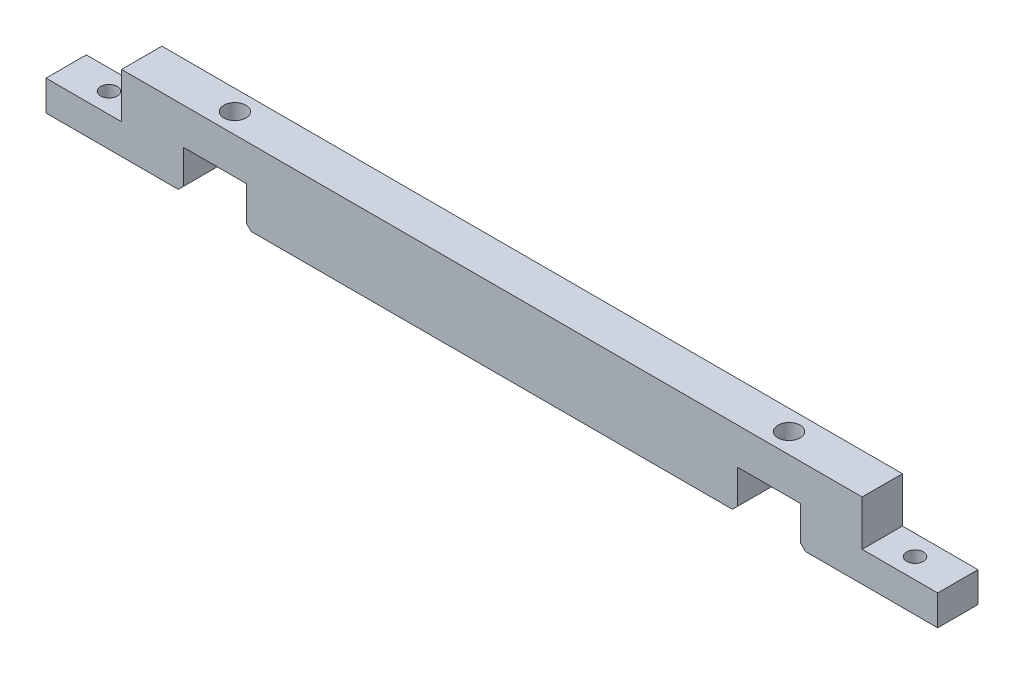
ISO-10303-21;
HEADER;
FILE_DESCRIPTION(('STEP AP214'),'2;1');
FILE_NAME('part.step','',(''),(''),'','','');
FILE_SCHEMA(('AUTOMOTIVE_DESIGN { 1 0 10303 214 1 1 1 1 }'));
ENDSEC;
DATA;
#1=APPLICATION_CONTEXT('core data for automotive mechanical design processes');
#2=APPLICATION_PROTOCOL_DEFINITION('international standard','automotive_design',2000,#1);
#3=PRODUCT_CONTEXT('',#1,'mechanical');
#4=PRODUCT('Part','Part','',(#3));
#5=PRODUCT_RELATED_PRODUCT_CATEGORY('part','',(#4));
#6=PRODUCT_DEFINITION_FORMATION('','',#4);
#7=PRODUCT_DEFINITION_CONTEXT('part definition',#1,'design');
#8=PRODUCT_DEFINITION('design','',#6,#7);
#9=PRODUCT_DEFINITION_SHAPE('','',#8);
#10=(LENGTH_UNIT() NAMED_UNIT(*) SI_UNIT(.MILLI.,.METRE.));
#11=(NAMED_UNIT(*) PLANE_ANGLE_UNIT() SI_UNIT($,.RADIAN.));
#12=(NAMED_UNIT(*) SI_UNIT($,.STERADIAN.) SOLID_ANGLE_UNIT());
#13=UNCERTAINTY_MEASURE_WITH_UNIT(LENGTH_MEASURE(1.E-05),#10,'distance_accuracy_value','');
#14=(GEOMETRIC_REPRESENTATION_CONTEXT(3) GLOBAL_UNCERTAINTY_ASSIGNED_CONTEXT((#13)) GLOBAL_UNIT_ASSIGNED_CONTEXT((#10,
#11,#12)) REPRESENTATION_CONTEXT('',''));
#15=CARTESIAN_POINT('',(0.,0.,0.));
#16=DIRECTION('',(0.,0.,1.));
#17=DIRECTION('',(1.,0.,0.));
#18=AXIS2_PLACEMENT_3D('',#15,#16,#17);
#19=CARTESIAN_POINT('',(-177.,15.,-8.));
#20=DIRECTION('',(0.,0.,1.));
#21=DIRECTION('',(1.,0.,0.));
#22=AXIS2_PLACEMENT_3D('',#19,#20,#21);
#23=PLANE('',#22);
#24=DIRECTION('',(-1.,0.,0.));
#25=VECTOR('',#24,1.);
#26=CARTESIAN_POINT('',(177.,-3.,-8.));
#27=LINE('',#26,#25);
#28=CARTESIAN_POINT('',(177.,-3.,-8.));
#29=VERTEX_POINT('',#28);
#30=CARTESIAN_POINT('',(147.,-3.,-8.));
#31=VERTEX_POINT('',#30);
#32=EDGE_CURVE('E192',#29,#31,#27,.T.);
#33=ORIENTED_EDGE('',*,*,#32,.F.);
#34=DIRECTION('',(0.,-1.,0.));
#35=VECTOR('',#34,1.);
#36=CARTESIAN_POINT('',(177.,15.,-8.));
#37=LINE('',#36,#35);
#38=CARTESIAN_POINT('',(177.,-15.,-8.));
#39=VERTEX_POINT('',#38);
#40=EDGE_CURVE('E359',#29,#39,#37,.T.);
#41=ORIENTED_EDGE('',*,*,#40,.T.);
#42=DIRECTION('',(-1.,0.,0.));
#43=VECTOR('',#42,1.);
#44=CARTESIAN_POINT('',(-177.,-15.,-8.));
#45=LINE('',#44,#43);
#46=CARTESIAN_POINT('',(124.5,-15.,-8.));
#47=VERTEX_POINT('',#46);
#48=EDGE_CURVE('E337',#39,#47,#45,.T.);
#49=ORIENTED_EDGE('',*,*,#48,.T.);
#50=DIRECTION('',(0.707106781186538,-0.707106781186557,0.));
#51=VECTOR('',#50,1.);
#52=CARTESIAN_POINT('',(124.5,-15.,-8.));
#53=LINE('',#52,#51);
#54=CARTESIAN_POINT('',(122.5,-13.,-8.));
#55=VERTEX_POINT('',#54);
#56=EDGE_CURVE('E372',#47,#55,#53,.F.);
#57=ORIENTED_EDGE('',*,*,#56,.T.);
#58=DIRECTION('',(0.,1.,0.));
#59=VECTOR('',#58,1.);
#60=CARTESIAN_POINT('',(122.5,0.5,-8.));
#61=LINE('',#60,#59);
#62=CARTESIAN_POINT('',(122.5,0.5,-8.));
#63=VERTEX_POINT('',#62);
#64=EDGE_CURVE('E298',#55,#63,#61,.T.);
#65=ORIENTED_EDGE('',*,*,#64,.T.);
#66=DIRECTION('',(-1.,0.,0.));
#67=VECTOR('',#66,1.);
#68=CARTESIAN_POINT('',(97.5,0.5,-8.));
#69=LINE('',#68,#67);
#70=CARTESIAN_POINT('',(97.5,0.5,-8.));
#71=VERTEX_POINT('',#70);
#72=EDGE_CURVE('E302',#63,#71,#69,.T.);
#73=ORIENTED_EDGE('',*,*,#72,.T.);
#74=DIRECTION('',(0.,-1.,0.));
#75=VECTOR('',#74,1.);
#76=CARTESIAN_POINT('',(97.5,0.5,-8.));
#77=LINE('',#76,#75);
#78=CARTESIAN_POINT('',(97.5,-12.9999999999999,-8.));
#79=VERTEX_POINT('',#78);
#80=EDGE_CURVE('E294',#71,#79,#77,.T.);
#81=ORIENTED_EDGE('',*,*,#80,.T.);
#82=DIRECTION('',(0.707106781186538,0.707106781186557,0.));
#83=VECTOR('',#82,1.);
#84=CARTESIAN_POINT('',(95.5,-15.,-8.));
#85=LINE('',#84,#83);
#86=CARTESIAN_POINT('',(95.5,-15.,-8.));
#87=VERTEX_POINT('',#86);
#88=EDGE_CURVE('E369',#79,#87,#85,.F.);
#89=ORIENTED_EDGE('',*,*,#88,.T.);
#90=CARTESIAN_POINT('',(-95.5,-15.,-8.));
#91=VERTEX_POINT('',#90);
#92=EDGE_CURVE('E342',#87,#91,#45,.T.);
#93=ORIENTED_EDGE('',*,*,#92,.T.);
#94=DIRECTION('',(-0.707106781186538,0.707106781186557,0.));
#95=VECTOR('',#94,1.);
#96=CARTESIAN_POINT('',(-97.5,-12.9999999999999,-8.));
#97=LINE('',#96,#95);
#98=CARTESIAN_POINT('',(-97.5,-12.9999999999999,-8.));
#99=VERTEX_POINT('',#98);
#100=EDGE_CURVE('E402',#91,#99,#97,.T.);
#101=ORIENTED_EDGE('',*,*,#100,.T.);
#102=DIRECTION('',(0.,-1.,0.));
#103=VECTOR('',#102,1.);
#104=CARTESIAN_POINT('',(-97.5,0.5,-8.));
#105=LINE('',#104,#103);
#106=CARTESIAN_POINT('',(-97.5,0.5,-8.));
#107=VERTEX_POINT('',#106);
#108=EDGE_CURVE('E268',#107,#99,#105,.T.);
#109=ORIENTED_EDGE('',*,*,#108,.F.);
#110=DIRECTION('',(1.,0.,0.));
#111=VECTOR('',#110,1.);
#112=CARTESIAN_POINT('',(-97.5,0.5,-8.));
#113=LINE('',#112,#111);
#114=CARTESIAN_POINT('',(-122.5,0.5,-8.));
#115=VERTEX_POINT('',#114);
#116=EDGE_CURVE('E272',#115,#107,#113,.T.);
#117=ORIENTED_EDGE('',*,*,#116,.F.);
#118=DIRECTION('',(0.,1.,0.));
#119=VECTOR('',#118,1.);
#120=CARTESIAN_POINT('',(-122.5,0.5,-8.));
#121=LINE('',#120,#119);
#122=CARTESIAN_POINT('',(-122.5,-13.,-8.));
#123=VERTEX_POINT('',#122);
#124=EDGE_CURVE('E276',#123,#115,#121,.T.);
#125=ORIENTED_EDGE('',*,*,#124,.F.);
#126=DIRECTION('',(-0.707106781186538,-0.707106781186557,0.));
#127=VECTOR('',#126,1.);
#128=CARTESIAN_POINT('',(-122.5,-13.,-8.));
#129=LINE('',#128,#127);
#130=CARTESIAN_POINT('',(-124.5,-15.,-8.));
#131=VERTEX_POINT('',#130);
#132=EDGE_CURVE('E405',#123,#131,#129,.T.);
#133=ORIENTED_EDGE('',*,*,#132,.T.);
#134=CARTESIAN_POINT('',(-177.,-15.,-8.));
#135=VERTEX_POINT('',#134);
#136=EDGE_CURVE('E336',#131,#135,#45,.T.);
#137=ORIENTED_EDGE('',*,*,#136,.T.);
#138=DIRECTION('',(0.,-1.,0.));
#139=VECTOR('',#138,1.);
#140=CARTESIAN_POINT('',(-177.,15.,-8.));
#141=LINE('',#140,#139);
#142=CARTESIAN_POINT('',(-177.,-3.,-8.));
#143=VERTEX_POINT('',#142);
#144=EDGE_CURVE('E356',#143,#135,#141,.T.);
#145=ORIENTED_EDGE('',*,*,#144,.F.);
#146=DIRECTION('',(1.,0.,0.));
#147=VECTOR('',#146,1.);
#148=CARTESIAN_POINT('',(-177.,-3.,-8.));
#149=LINE('',#148,#147);
#150=CARTESIAN_POINT('',(-147.,-3.,-8.));
#151=VERTEX_POINT('',#150);
#152=EDGE_CURVE('E229',#143,#151,#149,.T.);
#153=ORIENTED_EDGE('',*,*,#152,.T.);
#154=DIRECTION('',(0.,1.,0.));
#155=VECTOR('',#154,1.);
#156=CARTESIAN_POINT('',(-147.,15.,-8.));
#157=LINE('',#156,#155);
#158=CARTESIAN_POINT('',(-147.,15.,-8.));
#159=VERTEX_POINT('',#158);
#160=EDGE_CURVE('E233',#151,#159,#157,.T.);
#161=ORIENTED_EDGE('',*,*,#160,.T.);
#162=DIRECTION('',(-1.,0.,0.));
#163=VECTOR('',#162,1.);
#164=CARTESIAN_POINT('',(-177.,15.,-8.));
#165=LINE('',#164,#163);
#166=CARTESIAN_POINT('',(147.,15.,-8.));
#167=VERTEX_POINT('',#166);
#168=EDGE_CURVE('E211',#167,#159,#165,.T.);
#169=ORIENTED_EDGE('',*,*,#168,.F.);
#170=DIRECTION('',(0.,1.,0.));
#171=VECTOR('',#170,1.);
#172=CARTESIAN_POINT('',(147.,15.,-8.));
#173=LINE('',#172,#171);
#174=EDGE_CURVE('E70',#31,#167,#173,.T.);
#175=ORIENTED_EDGE('',*,*,#174,.F.);
#176=EDGE_LOOP('',(#33,#41,#49,#57,#65,#73,#81,#89,#93,#101,#109,#117,#125,#133,#137,#145,#153,
#161,#169,#175));
#177=FACE_BOUND('',#176,.T.);
#178=ADVANCED_FACE('F51',(#177),#23,.F.);
#179=CARTESIAN_POINT('',(-177.,15.,8.));
#180=DIRECTION('',(0.,0.,-1.));
#181=DIRECTION('',(-1.,0.,0.));
#182=AXIS2_PLACEMENT_3D('',#179,#180,#181);
#183=PLANE('',#182);
#184=DIRECTION('',(-1.,0.,0.));
#185=VECTOR('',#184,1.);
#186=CARTESIAN_POINT('',(177.,-3.,8.));
#187=LINE('',#186,#185);
#188=CARTESIAN_POINT('',(177.,-3.,8.));
#189=VERTEX_POINT('',#188);
#190=CARTESIAN_POINT('',(147.,-3.,8.));
#191=VERTEX_POINT('',#190);
#192=EDGE_CURVE('E213',#189,#191,#187,.T.);
#193=ORIENTED_EDGE('',*,*,#192,.T.);
#194=DIRECTION('',(0.,1.,0.));
#195=VECTOR('',#194,1.);
#196=CARTESIAN_POINT('',(147.,15.,8.));
#197=LINE('',#196,#195);
#198=CARTESIAN_POINT('',(147.,15.,8.));
#199=VERTEX_POINT('',#198);
#200=EDGE_CURVE('E205',#191,#199,#197,.T.);
#201=ORIENTED_EDGE('',*,*,#200,.T.);
#202=DIRECTION('',(1.,0.,0.));
#203=VECTOR('',#202,1.);
#204=CARTESIAN_POINT('',(-177.,15.,8.));
#205=LINE('',#204,#203);
#206=CARTESIAN_POINT('',(-147.,15.,8.));
#207=VERTEX_POINT('',#206);
#208=EDGE_CURVE('E326',#207,#199,#205,.T.);
#209=ORIENTED_EDGE('',*,*,#208,.F.);
#210=DIRECTION('',(0.,1.,0.));
#211=VECTOR('',#210,1.);
#212=CARTESIAN_POINT('',(-147.,15.,8.));
#213=LINE('',#212,#211);
#214=CARTESIAN_POINT('',(-147.,-3.,8.));
#215=VERTEX_POINT('',#214);
#216=EDGE_CURVE('E78',#215,#207,#213,.T.);
#217=ORIENTED_EDGE('',*,*,#216,.F.);
#218=DIRECTION('',(1.,0.,0.));
#219=VECTOR('',#218,1.);
#220=CARTESIAN_POINT('',(-177.,-3.,8.));
#221=LINE('',#220,#219);
#222=CARTESIAN_POINT('',(-177.,-3.,8.));
#223=VERTEX_POINT('',#222);
#224=EDGE_CURVE('E225',#223,#215,#221,.T.);
#225=ORIENTED_EDGE('',*,*,#224,.F.);
#226=DIRECTION('',(0.,-1.,0.));
#227=VECTOR('',#226,1.);
#228=CARTESIAN_POINT('',(-177.,15.,8.));
#229=LINE('',#228,#227);
#230=CARTESIAN_POINT('',(-177.,-15.,8.));
#231=VERTEX_POINT('',#230);
#232=EDGE_CURVE('E353',#223,#231,#229,.T.);
#233=ORIENTED_EDGE('',*,*,#232,.T.);
#234=DIRECTION('',(1.,0.,0.));
#235=VECTOR('',#234,1.);
#236=CARTESIAN_POINT('',(-177.,-15.,8.));
#237=LINE('',#236,#235);
#238=CARTESIAN_POINT('',(-124.5,-15.,8.));
#239=VERTEX_POINT('',#238);
#240=EDGE_CURVE('E327',#231,#239,#237,.T.);
#241=ORIENTED_EDGE('',*,*,#240,.T.);
#242=DIRECTION('',(0.707106781186538,0.707106781186557,0.));
#243=VECTOR('',#242,1.);
#244=CARTESIAN_POINT('',(-122.5,-13.,8.));
#245=LINE('',#244,#243);
#246=CARTESIAN_POINT('',(-122.5,-13.,8.));
#247=VERTEX_POINT('',#246);
#248=EDGE_CURVE('E414',#239,#247,#245,.T.);
#249=ORIENTED_EDGE('',*,*,#248,.T.);
#250=DIRECTION('',(0.,-1.,0.));
#251=VECTOR('',#250,1.);
#252=CARTESIAN_POINT('',(-122.5,15.,8.));
#253=LINE('',#252,#251);
#254=CARTESIAN_POINT('',(-122.5,0.5,8.));
#255=VERTEX_POINT('',#254);
#256=EDGE_CURVE('E391',#255,#247,#253,.T.);
#257=ORIENTED_EDGE('',*,*,#256,.F.);
#258=DIRECTION('',(1.,0.,0.));
#259=VECTOR('',#258,1.);
#260=CARTESIAN_POINT('',(-97.5,0.5,8.));
#261=LINE('',#260,#259);
#262=CARTESIAN_POINT('',(-97.5,0.5,8.));
#263=VERTEX_POINT('',#262);
#264=EDGE_CURVE('E273',#255,#263,#261,.T.);
#265=ORIENTED_EDGE('',*,*,#264,.T.);
#266=DIRECTION('',(0.,-1.,0.));
#267=VECTOR('',#266,1.);
#268=CARTESIAN_POINT('',(-97.5,0.5,8.));
#269=LINE('',#268,#267);
#270=CARTESIAN_POINT('',(-97.5,-12.9999999999999,8.));
#271=VERTEX_POINT('',#270);
#272=EDGE_CURVE('E280',#263,#271,#269,.T.);
#273=ORIENTED_EDGE('',*,*,#272,.T.);
#274=DIRECTION('',(0.707106781186538,-0.707106781186557,0.));
#275=VECTOR('',#274,1.);
#276=CARTESIAN_POINT('',(-97.5,-12.9999999999999,8.));
#277=LINE('',#276,#275);
#278=CARTESIAN_POINT('',(-95.5,-15.,8.));
#279=VERTEX_POINT('',#278);
#280=EDGE_CURVE('E411',#271,#279,#277,.T.);
#281=ORIENTED_EDGE('',*,*,#280,.T.);
#282=CARTESIAN_POINT('',(95.5,-15.,8.));
#283=VERTEX_POINT('',#282);
#284=EDGE_CURVE('E350',#279,#283,#237,.T.);
#285=ORIENTED_EDGE('',*,*,#284,.T.);
#286=DIRECTION('',(-0.707106781186538,-0.707106781186557,0.));
#287=VECTOR('',#286,1.);
#288=CARTESIAN_POINT('',(95.5,-15.,8.));
#289=LINE('',#288,#287);
#290=CARTESIAN_POINT('',(97.5,-12.9999999999999,8.));
#291=VERTEX_POINT('',#290);
#292=EDGE_CURVE('E378',#283,#291,#289,.F.);
#293=ORIENTED_EDGE('',*,*,#292,.T.);
#294=DIRECTION('',(0.,-1.,0.));
#295=VECTOR('',#294,1.);
#296=CARTESIAN_POINT('',(97.5,0.5,8.));
#297=LINE('',#296,#295);
#298=CARTESIAN_POINT('',(97.5,0.5,8.));
#299=VERTEX_POINT('',#298);
#300=EDGE_CURVE('E307',#299,#291,#297,.T.);
#301=ORIENTED_EDGE('',*,*,#300,.F.);
#302=DIRECTION('',(-1.,0.,0.));
#303=VECTOR('',#302,1.);
#304=CARTESIAN_POINT('',(97.5,0.5,8.));
#305=LINE('',#304,#303);
#306=CARTESIAN_POINT('',(122.5,0.5,8.));
#307=VERTEX_POINT('',#306);
#308=EDGE_CURVE('E299',#307,#299,#305,.T.);
#309=ORIENTED_EDGE('',*,*,#308,.F.);
#310=DIRECTION('',(0.,1.,0.));
#311=VECTOR('',#310,1.);
#312=CARTESIAN_POINT('',(122.5,0.5,8.));
#313=LINE('',#312,#311);
#314=CARTESIAN_POINT('',(122.5,-13.,8.));
#315=VERTEX_POINT('',#314);
#316=EDGE_CURVE('E311',#315,#307,#313,.T.);
#317=ORIENTED_EDGE('',*,*,#316,.F.);
#318=DIRECTION('',(-0.707106781186538,0.707106781186557,0.));
#319=VECTOR('',#318,1.);
#320=CARTESIAN_POINT('',(124.5,-15.,8.));
#321=LINE('',#320,#319);
#322=CARTESIAN_POINT('',(124.5,-15.,8.));
#323=VERTEX_POINT('',#322);
#324=EDGE_CURVE('E381',#315,#323,#321,.F.);
#325=ORIENTED_EDGE('',*,*,#324,.T.);
#326=CARTESIAN_POINT('',(177.,-15.,8.));
#327=VERTEX_POINT('',#326);
#328=EDGE_CURVE('E346',#323,#327,#237,.T.);
#329=ORIENTED_EDGE('',*,*,#328,.T.);
#330=DIRECTION('',(0.,-1.,0.));
#331=VECTOR('',#330,1.);
#332=CARTESIAN_POINT('',(177.,15.,8.));
#333=LINE('',#332,#331);
#334=EDGE_CURVE('E331',#189,#327,#333,.T.);
#335=ORIENTED_EDGE('',*,*,#334,.F.);
#336=EDGE_LOOP('',(#193,#201,#209,#217,#225,#233,#241,#249,#257,#265,#273,#281,#285,#293,#301,
#309,#317,#325,#329,#335));
#337=FACE_BOUND('',#336,.T.);
#338=ADVANCED_FACE('F518',(#337),#183,.F.);
#339=CARTESIAN_POINT('',(177.,15.,-8.));
#340=DIRECTION('',(-1.,0.,0.));
#341=DIRECTION('',(0.,0.,1.));
#342=AXIS2_PLACEMENT_3D('',#339,#340,#341);
#343=PLANE('',#342);
#344=DIRECTION('',(0.,0.,1.));
#345=VECTOR('',#344,1.);
#346=CARTESIAN_POINT('',(177.,-3.,-8.));
#347=LINE('',#346,#345);
#348=EDGE_CURVE('E197',#29,#189,#347,.T.);
#349=ORIENTED_EDGE('',*,*,#348,.T.);
#350=ORIENTED_EDGE('',*,*,#334,.T.);
#351=DIRECTION('',(0.,0.,-1.));
#352=VECTOR('',#351,1.);
#353=CARTESIAN_POINT('',(177.,-15.,-8.));
#354=LINE('',#353,#352);
#355=EDGE_CURVE('E332',#327,#39,#354,.T.);
#356=ORIENTED_EDGE('',*,*,#355,.T.);
#357=ORIENTED_EDGE('',*,*,#40,.F.);
#358=EDGE_LOOP('',(#349,#350,#356,#357));
#359=FACE_BOUND('',#358,.T.);
#360=ADVANCED_FACE('F541',(#359),#343,.F.);
#361=CARTESIAN_POINT('',(0.,15.,0.));
#362=DIRECTION('',(0.,1.,0.));
#363=DIRECTION('',(0.,0.,1.));
#364=AXIS2_PLACEMENT_3D('',#361,#362,#363);
#365=PLANE('',#364);
#366=CARTESIAN_POINT('',(-110.,15.,0.));
#367=DIRECTION('',(0.,1.,0.));
#368=DIRECTION('',(0.,0.,1.));
#369=AXIS2_PLACEMENT_3D('',#366,#367,#368);
#370=CIRCLE('',#369,4.39999999999999);
#371=CARTESIAN_POINT('',(-110.,15.,4.39999999999999));
#372=VERTEX_POINT('',#371);
#373=EDGE_CURVE('E245',#372,#372,#370,.T.);
#374=ORIENTED_EDGE('',*,*,#373,.F.);
#375=EDGE_LOOP('',(#374));
#376=FACE_BOUND('',#375,.T.);
#377=CARTESIAN_POINT('',(110.,15.,0.));
#378=DIRECTION('',(0.,1.,0.));
#379=DIRECTION('',(0.,0.,1.));
#380=AXIS2_PLACEMENT_3D('',#377,#378,#379);
#381=CIRCLE('',#380,4.39999999999999);
#382=CARTESIAN_POINT('',(110.,15.,4.39999999999999));
#383=VERTEX_POINT('',#382);
#384=EDGE_CURVE('E259',#383,#383,#381,.T.);
#385=ORIENTED_EDGE('',*,*,#384,.F.);
#386=EDGE_LOOP('',(#385));
#387=FACE_BOUND('',#386,.T.);
#388=ORIENTED_EDGE('',*,*,#208,.T.);
#389=DIRECTION('',(0.,0.,1.));
#390=VECTOR('',#389,1.);
#391=CARTESIAN_POINT('',(147.,15.,-8.));
#392=LINE('',#391,#390);
#393=EDGE_CURVE('E201',#167,#199,#392,.T.);
#394=ORIENTED_EDGE('',*,*,#393,.F.);
#395=ORIENTED_EDGE('',*,*,#168,.T.);
#396=DIRECTION('',(0.,0.,1.));
#397=VECTOR('',#396,1.);
#398=CARTESIAN_POINT('',(-147.,15.,-8.));
#399=LINE('',#398,#397);
#400=EDGE_CURVE('E242',#159,#207,#399,.T.);
#401=ORIENTED_EDGE('',*,*,#400,.T.);
#402=EDGE_LOOP('',(#388,#394,#395,#401));
#403=FACE_BOUND('',#402,.T.);
#404=ADVANCED_FACE('F521',(#376,#387,#403),#365,.T.);
#405=CARTESIAN_POINT('',(0.,-15.,0.));
#406=DIRECTION('',(0.,1.,0.));
#407=DIRECTION('',(0.,0.,1.));
#408=AXIS2_PLACEMENT_3D('',#405,#406,#407);
#409=PLANE('',#408);
#410=ORIENTED_EDGE('',*,*,#284,.F.);
#411=DIRECTION('',(0.,0.,-1.));
#412=VECTOR('',#411,1.);
#413=CARTESIAN_POINT('',(-95.5,-15.,-8.));
#414=LINE('',#413,#412);
#415=EDGE_CURVE('E11',#279,#91,#414,.T.);
#416=ORIENTED_EDGE('',*,*,#415,.T.);
#417=ORIENTED_EDGE('',*,*,#92,.F.);
#418=DIRECTION('',(0.,0.,1.));
#419=VECTOR('',#418,1.);
#420=CARTESIAN_POINT('',(95.5,-15.,0.));
#421=LINE('',#420,#419);
#422=EDGE_CURVE('E384',#87,#283,#421,.T.);
#423=ORIENTED_EDGE('',*,*,#422,.T.);
#424=EDGE_LOOP('',(#410,#416,#417,#423));
#425=FACE_BOUND('',#424,.T.);
#426=ADVANCED_FACE('F464',(#425),#409,.F.);
#427=CARTESIAN_POINT('',(-160.,-15.,0.));
#428=DIRECTION('',(0.,-1.,0.));
#429=DIRECTION('',(0.,0.,-1.));
#430=AXIS2_PLACEMENT_3D('',#427,#428,#429);
#431=CIRCLE('',#430,5.50000000000001);
#432=CARTESIAN_POINT('',(-160.,-15.,-5.50000000000001));
#433=VERTEX_POINT('',#432);
#434=EDGE_CURVE('E436',#433,#433,#431,.T.);
#435=ORIENTED_EDGE('',*,*,#434,.F.);
#436=EDGE_LOOP('',(#435));
#437=FACE_BOUND('',#436,.T.);
#438=ORIENTED_EDGE('',*,*,#136,.F.);
#439=DIRECTION('',(0.,0.,1.));
#440=VECTOR('',#439,1.);
#441=CARTESIAN_POINT('',(-124.5,-15.,8.));
#442=LINE('',#441,#440);
#443=EDGE_CURVE('E408',#131,#239,#442,.T.);
#444=ORIENTED_EDGE('',*,*,#443,.T.);
#445=ORIENTED_EDGE('',*,*,#240,.F.);
#446=DIRECTION('',(0.,0.,1.));
#447=VECTOR('',#446,1.);
#448=CARTESIAN_POINT('',(-177.,-15.,-8.));
#449=LINE('',#448,#447);
#450=EDGE_CURVE('E341',#135,#231,#449,.T.);
#451=ORIENTED_EDGE('',*,*,#450,.F.);
#452=EDGE_LOOP('',(#438,#444,#445,#451));
#453=FACE_BOUND('',#452,.T.);
#454=ADVANCED_FACE('F465',(#437,#453),#409,.F.);
#455=CARTESIAN_POINT('',(-110.,15.,0.));
#456=DIRECTION('',(0.,1.,0.));
#457=DIRECTION('',(0.,0.,1.));
#458=AXIS2_PLACEMENT_3D('',#455,#456,#457);
#459=CYLINDRICAL_SURFACE('',#458,2.1);
#460=CARTESIAN_POINT('',(-110.,4.61802057623661,0.));
#461=DIRECTION('',(0.,1.,0.));
#462=DIRECTION('',(0.,0.,1.));
#463=AXIS2_PLACEMENT_3D('',#460,#461,#462);
#464=CIRCLE('',#463,2.1);
#465=CARTESIAN_POINT('',(-110.,4.61802057623661,2.1));
#466=VERTEX_POINT('',#465);
#467=EDGE_CURVE('E258',#466,#466,#464,.T.);
#468=ORIENTED_EDGE('',*,*,#467,.T.);
#469=EDGE_LOOP('',(#468));
#470=FACE_BOUND('',#469,.T.);
#471=CARTESIAN_POINT('',(-110.,0.5,0.));
#472=DIRECTION('',(0.,-1.,0.));
#473=DIRECTION('',(0.,0.,-1.));
#474=AXIS2_PLACEMENT_3D('',#471,#472,#473);
#475=CIRCLE('',#474,2.1);
#476=CARTESIAN_POINT('',(-110.,0.5,-2.1));
#477=VERTEX_POINT('',#476);
#478=EDGE_CURVE('E290',#477,#477,#475,.F.);
#479=ORIENTED_EDGE('',*,*,#478,.F.);
#480=EDGE_LOOP('',(#479));
#481=FACE_BOUND('',#480,.T.);
#482=ADVANCED_FACE('F600',(#470,#481),#459,.F.);
#483=CARTESIAN_POINT('',(-177.,15.,-8.));
#484=DIRECTION('',(1.,0.,0.));
#485=DIRECTION('',(0.,0.,-1.));
#486=AXIS2_PLACEMENT_3D('',#483,#484,#485);
#487=PLANE('',#486);
#488=ORIENTED_EDGE('',*,*,#232,.F.);
#489=DIRECTION('',(0.,0.,1.));
#490=VECTOR('',#489,1.);
#491=CARTESIAN_POINT('',(-177.,-3.,-8.));
#492=LINE('',#491,#490);
#493=EDGE_CURVE('E236',#143,#223,#492,.T.);
#494=ORIENTED_EDGE('',*,*,#493,.F.);
#495=ORIENTED_EDGE('',*,*,#144,.T.);
#496=ORIENTED_EDGE('',*,*,#450,.T.);
#497=EDGE_LOOP('',(#488,#494,#495,#496));
#498=FACE_BOUND('',#497,.T.);
#499=ADVANCED_FACE('F462',(#498),#487,.F.);
#500=CARTESIAN_POINT('',(160.,-15.,0.));
#501=DIRECTION('',(0.,-1.,0.));
#502=DIRECTION('',(0.,0.,-1.));
#503=AXIS2_PLACEMENT_3D('',#500,#501,#502);
#504=CIRCLE('',#503,5.50000000000001);
#505=CARTESIAN_POINT('',(160.,-15.,-5.50000000000001));
#506=VERTEX_POINT('',#505);
#507=EDGE_CURVE('E451',#506,#506,#504,.T.);
#508=ORIENTED_EDGE('',*,*,#507,.F.);
#509=EDGE_LOOP('',(#508));
#510=FACE_BOUND('',#509,.T.);
#511=ORIENTED_EDGE('',*,*,#328,.F.);
#512=DIRECTION('',(0.,0.,-1.));
#513=VECTOR('',#512,1.);
#514=CARTESIAN_POINT('',(124.5,-15.,0.));
#515=LINE('',#514,#513);
#516=EDGE_CURVE('E362',#323,#47,#515,.T.);
#517=ORIENTED_EDGE('',*,*,#516,.T.);
#518=ORIENTED_EDGE('',*,*,#48,.F.);
#519=ORIENTED_EDGE('',*,*,#355,.F.);
#520=EDGE_LOOP('',(#511,#517,#518,#519));
#521=FACE_BOUND('',#520,.T.);
#522=ADVANCED_FACE('F458',(#510,#521),#409,.F.);
#523=CARTESIAN_POINT('',(110.,15.,0.));
#524=DIRECTION('',(0.,1.,0.));
#525=DIRECTION('',(0.,0.,1.));
#526=AXIS2_PLACEMENT_3D('',#523,#524,#525);
#527=CYLINDRICAL_SURFACE('',#526,2.1);
#528=CARTESIAN_POINT('',(110.,4.61802057623661,0.));
#529=DIRECTION('',(0.,1.,0.));
#530=DIRECTION('',(0.,0.,1.));
#531=AXIS2_PLACEMENT_3D('',#528,#529,#530);
#532=CIRCLE('',#531,2.1);
#533=CARTESIAN_POINT('',(110.,4.61802057623661,2.1));
#534=VERTEX_POINT('',#533);
#535=EDGE_CURVE('E267',#534,#534,#532,.T.);
#536=ORIENTED_EDGE('',*,*,#535,.T.);
#537=EDGE_LOOP('',(#536));
#538=FACE_BOUND('',#537,.T.);
#539=CARTESIAN_POINT('',(110.,0.5,0.));
#540=DIRECTION('',(0.,1.,0.));
#541=DIRECTION('',(0.,0.,1.));
#542=AXIS2_PLACEMENT_3D('',#539,#540,#541);
#543=CIRCLE('',#542,2.1);
#544=CARTESIAN_POINT('',(110.,0.5,2.1));
#545=VERTEX_POINT('',#544);
#546=EDGE_CURVE('E320',#545,#545,#543,.F.);
#547=ORIENTED_EDGE('',*,*,#546,.T.);
#548=EDGE_LOOP('',(#547));
#549=FACE_BOUND('',#548,.T.);
#550=ADVANCED_FACE('F461',(#538,#549),#527,.F.);
#551=CARTESIAN_POINT('',(97.5,0.5,-8.));
#552=DIRECTION('',(-1.,0.,0.));
#553=DIRECTION('',(0.,0.,1.));
#554=AXIS2_PLACEMENT_3D('',#551,#552,#553);
#555=PLANE('',#554);
#556=ORIENTED_EDGE('',*,*,#300,.T.);
#557=DIRECTION('',(0.,0.,-1.));
#558=VECTOR('',#557,1.);
#559=CARTESIAN_POINT('',(97.5,-12.9999999999999,-8.));
#560=LINE('',#559,#558);
#561=EDGE_CURVE('E388',#291,#79,#560,.T.);
#562=ORIENTED_EDGE('',*,*,#561,.T.);
#563=ORIENTED_EDGE('',*,*,#80,.F.);
#564=DIRECTION('',(0.,0.,1.));
#565=VECTOR('',#564,1.);
#566=CARTESIAN_POINT('',(97.5,0.5,-8.));
#567=LINE('',#566,#565);
#568=EDGE_CURVE('E317',#71,#299,#567,.T.);
#569=ORIENTED_EDGE('',*,*,#568,.T.);
#570=EDGE_LOOP('',(#556,#562,#563,#569));
#571=FACE_BOUND('',#570,.T.);
#572=ADVANCED_FACE('F597',(#571),#555,.F.);
#573=CARTESIAN_POINT('',(122.5,0.5,-8.));
#574=DIRECTION('',(1.,0.,0.));
#575=DIRECTION('',(0.,0.,-1.));
#576=AXIS2_PLACEMENT_3D('',#573,#574,#575);
#577=PLANE('',#576);
#578=ORIENTED_EDGE('',*,*,#64,.F.);
#579=DIRECTION('',(0.,0.,1.));
#580=VECTOR('',#579,1.);
#581=CARTESIAN_POINT('',(122.5,-13.,-8.));
#582=LINE('',#581,#580);
#583=EDGE_CURVE('E375',#55,#315,#582,.T.);
#584=ORIENTED_EDGE('',*,*,#583,.T.);
#585=ORIENTED_EDGE('',*,*,#316,.T.);
#586=DIRECTION('',(0.,0.,1.));
#587=VECTOR('',#586,1.);
#588=CARTESIAN_POINT('',(122.5,0.5,-8.));
#589=LINE('',#588,#587);
#590=EDGE_CURVE('E306',#63,#307,#589,.T.);
#591=ORIENTED_EDGE('',*,*,#590,.F.);
#592=EDGE_LOOP('',(#578,#584,#585,#591));
#593=FACE_BOUND('',#592,.T.);
#594=ADVANCED_FACE('F481',(#593),#577,.F.);
#595=CARTESIAN_POINT('',(97.5,0.5,-8.));
#596=DIRECTION('',(0.,1.,0.));
#597=DIRECTION('',(0.,0.,1.));
#598=AXIS2_PLACEMENT_3D('',#595,#596,#597);
#599=PLANE('',#598);
#600=ORIENTED_EDGE('',*,*,#308,.T.);
#601=ORIENTED_EDGE('',*,*,#568,.F.);
#602=ORIENTED_EDGE('',*,*,#72,.F.);
#603=ORIENTED_EDGE('',*,*,#590,.T.);
#604=EDGE_LOOP('',(#600,#601,#602,#603));
#605=FACE_BOUND('',#604,.T.);
#606=ORIENTED_EDGE('',*,*,#546,.F.);
#607=EDGE_LOOP('',(#606));
#608=FACE_BOUND('',#607,.T.);
#609=ADVANCED_FACE('F486',(#605,#608),#599,.F.);
#610=CARTESIAN_POINT('',(124.5,-15.,0.));
#611=DIRECTION('',(0.707106781186557,0.707106781186538,0.));
#612=DIRECTION('',(0.,0.,-1.));
#613=AXIS2_PLACEMENT_3D('',#610,#611,#612);
#614=PLANE('',#613);
#615=ORIENTED_EDGE('',*,*,#324,.F.);
#616=ORIENTED_EDGE('',*,*,#583,.F.);
#617=ORIENTED_EDGE('',*,*,#56,.F.);
#618=ORIENTED_EDGE('',*,*,#516,.F.);
#619=EDGE_LOOP('',(#615,#616,#617,#618));
#620=FACE_BOUND('',#619,.T.);
#621=ADVANCED_FACE('F476',(#620),#614,.F.);
#622=CARTESIAN_POINT('',(95.5,-15.,0.));
#623=DIRECTION('',(-0.707106781186557,0.707106781186538,0.));
#624=DIRECTION('',(0.,0.,1.));
#625=AXIS2_PLACEMENT_3D('',#622,#623,#624);
#626=PLANE('',#625);
#627=ORIENTED_EDGE('',*,*,#88,.F.);
#628=ORIENTED_EDGE('',*,*,#561,.F.);
#629=ORIENTED_EDGE('',*,*,#292,.F.);
#630=ORIENTED_EDGE('',*,*,#422,.F.);
#631=EDGE_LOOP('',(#627,#628,#629,#630));
#632=FACE_BOUND('',#631,.T.);
#633=ADVANCED_FACE('F496',(#632),#626,.F.);
#634=CARTESIAN_POINT('',(-97.5,0.5,-8.));
#635=DIRECTION('',(-1.,0.,0.));
#636=DIRECTION('',(0.,0.,1.));
#637=AXIS2_PLACEMENT_3D('',#634,#635,#636);
#638=PLANE('',#637);
#639=ORIENTED_EDGE('',*,*,#108,.T.);
#640=DIRECTION('',(0.,0.,1.));
#641=VECTOR('',#640,1.);
#642=CARTESIAN_POINT('',(-97.5,-12.9999999999999,8.));
#643=LINE('',#642,#641);
#644=EDGE_CURVE('E62',#99,#271,#643,.T.);
#645=ORIENTED_EDGE('',*,*,#644,.T.);
#646=ORIENTED_EDGE('',*,*,#272,.F.);
#647=DIRECTION('',(0.,0.,1.));
#648=VECTOR('',#647,1.);
#649=CARTESIAN_POINT('',(-97.5,0.5,-8.));
#650=LINE('',#649,#648);
#651=EDGE_CURVE('E279',#107,#263,#650,.T.);
#652=ORIENTED_EDGE('',*,*,#651,.F.);
#653=EDGE_LOOP('',(#639,#645,#646,#652));
#654=FACE_BOUND('',#653,.T.);
#655=ADVANCED_FACE('F558',(#654),#638,.T.);
#656=CARTESIAN_POINT('',(-122.5,0.5,-8.));
#657=DIRECTION('',(1.,0.,0.));
#658=DIRECTION('',(0.,0.,-1.));
#659=AXIS2_PLACEMENT_3D('',#656,#657,#658);
#660=PLANE('',#659);
#661=ORIENTED_EDGE('',*,*,#256,.T.);
#662=DIRECTION('',(0.,0.,-1.));
#663=VECTOR('',#662,1.);
#664=CARTESIAN_POINT('',(-122.5,-13.,-8.));
#665=LINE('',#664,#663);
#666=EDGE_CURVE('E398',#247,#123,#665,.T.);
#667=ORIENTED_EDGE('',*,*,#666,.T.);
#668=ORIENTED_EDGE('',*,*,#124,.T.);
#669=DIRECTION('',(0.,0.,1.));
#670=VECTOR('',#669,1.);
#671=CARTESIAN_POINT('',(-122.5,0.5,-8.));
#672=LINE('',#671,#670);
#673=EDGE_CURVE('E287',#115,#255,#672,.T.);
#674=ORIENTED_EDGE('',*,*,#673,.T.);
#675=EDGE_LOOP('',(#661,#667,#668,#674));
#676=FACE_BOUND('',#675,.T.);
#677=ADVANCED_FACE('F571',(#676),#660,.T.);
#678=CARTESIAN_POINT('',(-97.5,0.5,-8.));
#679=DIRECTION('',(0.,-1.,0.));
#680=DIRECTION('',(0.,0.,-1.));
#681=AXIS2_PLACEMENT_3D('',#678,#679,#680);
#682=PLANE('',#681);
#683=ORIENTED_EDGE('',*,*,#264,.F.);
#684=ORIENTED_EDGE('',*,*,#673,.F.);
#685=ORIENTED_EDGE('',*,*,#116,.T.);
#686=ORIENTED_EDGE('',*,*,#651,.T.);
#687=EDGE_LOOP('',(#683,#684,#685,#686));
#688=FACE_BOUND('',#687,.T.);
#689=ORIENTED_EDGE('',*,*,#478,.T.);
#690=EDGE_LOOP('',(#689));
#691=FACE_BOUND('',#690,.T.);
#692=ADVANCED_FACE('F563',(#688,#691),#682,.T.);
#693=CARTESIAN_POINT('',(-122.5,-13.,-8.));
#694=DIRECTION('',(0.707106781186557,-0.707106781186538,0.));
#695=DIRECTION('',(0.,0.,1.));
#696=AXIS2_PLACEMENT_3D('',#693,#694,#695);
#697=PLANE('',#696);
#698=ORIENTED_EDGE('',*,*,#248,.F.);
#699=ORIENTED_EDGE('',*,*,#443,.F.);
#700=ORIENTED_EDGE('',*,*,#132,.F.);
#701=ORIENTED_EDGE('',*,*,#666,.F.);
#702=EDGE_LOOP('',(#698,#699,#700,#701));
#703=FACE_BOUND('',#702,.T.);
#704=ADVANCED_FACE('F559',(#703),#697,.T.);
#705=CARTESIAN_POINT('',(-97.5,-12.9999999999999,-8.));
#706=DIRECTION('',(-0.707106781186557,-0.707106781186538,0.));
#707=DIRECTION('',(0.,0.,-1.));
#708=AXIS2_PLACEMENT_3D('',#705,#706,#707);
#709=PLANE('',#708);
#710=ORIENTED_EDGE('',*,*,#100,.F.);
#711=ORIENTED_EDGE('',*,*,#415,.F.);
#712=ORIENTED_EDGE('',*,*,#280,.F.);
#713=ORIENTED_EDGE('',*,*,#644,.F.);
#714=EDGE_LOOP('',(#710,#711,#712,#713));
#715=FACE_BOUND('',#714,.T.);
#716=ADVANCED_FACE('F54',(#715),#709,.T.);
#717=CARTESIAN_POINT('',(110.,6.,0.));
#718=DIRECTION('',(0.,1.,0.));
#719=DIRECTION('',(0.,0.,1.));
#720=AXIS2_PLACEMENT_3D('',#717,#718,#719);
#721=CONICAL_SURFACE('',#720,4.4,1.02974425867665);
#722=CARTESIAN_POINT('',(110.,6.,0.));
#723=DIRECTION('',(0.,1.,0.));
#724=DIRECTION('',(0.,0.,1.));
#725=AXIS2_PLACEMENT_3D('',#722,#723,#724);
#726=CIRCLE('',#725,4.4);
#727=CARTESIAN_POINT('',(110.,6.,4.4));
#728=VERTEX_POINT('',#727);
#729=EDGE_CURVE('E263',#728,#728,#726,.T.);
#730=ORIENTED_EDGE('',*,*,#729,.T.);
#731=EDGE_LOOP('',(#730));
#732=FACE_BOUND('',#731,.T.);
#733=ORIENTED_EDGE('',*,*,#535,.F.);
#734=EDGE_LOOP('',(#733));
#735=FACE_BOUND('',#734,.T.);
#736=ADVANCED_FACE('F569',(#732,#735),#721,.F.);
#737=CARTESIAN_POINT('',(110.,15.,0.));
#738=DIRECTION('',(0.,1.,0.));
#739=DIRECTION('',(0.,0.,1.));
#740=AXIS2_PLACEMENT_3D('',#737,#738,#739);
#741=CYLINDRICAL_SURFACE('',#740,4.39999999999999);
#742=ORIENTED_EDGE('',*,*,#729,.F.);
#743=EDGE_LOOP('',(#742));
#744=FACE_BOUND('',#743,.T.);
#745=ORIENTED_EDGE('',*,*,#384,.T.);
#746=EDGE_LOOP('',(#745));
#747=FACE_BOUND('',#746,.T.);
#748=ADVANCED_FACE('F616',(#744,#747),#741,.F.);
#749=CARTESIAN_POINT('',(-110.,6.,0.));
#750=DIRECTION('',(0.,1.,0.));
#751=DIRECTION('',(0.,0.,1.));
#752=AXIS2_PLACEMENT_3D('',#749,#750,#751);
#753=CONICAL_SURFACE('',#752,4.4,1.02974425867665);
#754=CARTESIAN_POINT('',(-110.,6.,0.));
#755=DIRECTION('',(0.,1.,0.));
#756=DIRECTION('',(0.,0.,1.));
#757=AXIS2_PLACEMENT_3D('',#754,#755,#756);
#758=CIRCLE('',#757,4.4);
#759=CARTESIAN_POINT('',(-110.,6.,4.4));
#760=VERTEX_POINT('',#759);
#761=EDGE_CURVE('E254',#760,#760,#758,.T.);
#762=ORIENTED_EDGE('',*,*,#761,.T.);
#763=EDGE_LOOP('',(#762));
#764=FACE_BOUND('',#763,.T.);
#765=ORIENTED_EDGE('',*,*,#467,.F.);
#766=EDGE_LOOP('',(#765));
#767=FACE_BOUND('',#766,.T.);
#768=ADVANCED_FACE('F532',(#764,#767),#753,.F.);
#769=CARTESIAN_POINT('',(-110.,15.,0.));
#770=DIRECTION('',(0.,1.,0.));
#771=DIRECTION('',(0.,0.,1.));
#772=AXIS2_PLACEMENT_3D('',#769,#770,#771);
#773=CYLINDRICAL_SURFACE('',#772,4.39999999999999);
#774=ORIENTED_EDGE('',*,*,#761,.F.);
#775=EDGE_LOOP('',(#774));
#776=FACE_BOUND('',#775,.T.);
#777=ORIENTED_EDGE('',*,*,#373,.T.);
#778=EDGE_LOOP('',(#777));
#779=FACE_BOUND('',#778,.T.);
#780=ADVANCED_FACE('F525',(#776,#779),#773,.F.);
#781=CARTESIAN_POINT('',(-147.,15.,-8.));
#782=DIRECTION('',(1.,0.,0.));
#783=DIRECTION('',(0.,0.,-1.));
#784=AXIS2_PLACEMENT_3D('',#781,#782,#783);
#785=PLANE('',#784);
#786=ORIENTED_EDGE('',*,*,#216,.T.);
#787=ORIENTED_EDGE('',*,*,#400,.F.);
#788=ORIENTED_EDGE('',*,*,#160,.F.);
#789=DIRECTION('',(0.,0.,1.));
#790=VECTOR('',#789,1.);
#791=CARTESIAN_POINT('',(-147.,-3.,-8.));
#792=LINE('',#791,#790);
#793=EDGE_CURVE('E246',#151,#215,#792,.T.);
#794=ORIENTED_EDGE('',*,*,#793,.T.);
#795=EDGE_LOOP('',(#786,#787,#788,#794));
#796=FACE_BOUND('',#795,.T.);
#797=ADVANCED_FACE('F523',(#796),#785,.F.);
#798=CARTESIAN_POINT('',(-177.,-3.,-8.));
#799=DIRECTION('',(0.,-1.,0.));
#800=DIRECTION('',(0.,0.,-1.));
#801=AXIS2_PLACEMENT_3D('',#798,#799,#800);
#802=PLANE('',#801);
#803=CARTESIAN_POINT('',(-160.,-3.,0.));
#804=DIRECTION('',(0.,-1.,0.));
#805=DIRECTION('',(0.,0.,-1.));
#806=AXIS2_PLACEMENT_3D('',#803,#804,#805);
#807=CIRCLE('',#806,3.3);
#808=CARTESIAN_POINT('',(-160.,-3.,-3.3));
#809=VERTEX_POINT('',#808);
#810=EDGE_CURVE('E222',#809,#809,#807,.T.);
#811=ORIENTED_EDGE('',*,*,#810,.T.);
#812=EDGE_LOOP('',(#811));
#813=FACE_BOUND('',#812,.T.);
#814=ORIENTED_EDGE('',*,*,#224,.T.);
#815=ORIENTED_EDGE('',*,*,#793,.F.);
#816=ORIENTED_EDGE('',*,*,#152,.F.);
#817=ORIENTED_EDGE('',*,*,#493,.T.);
#818=EDGE_LOOP('',(#814,#815,#816,#817));
#819=FACE_BOUND('',#818,.T.);
#820=ADVANCED_FACE('F517',(#813,#819),#802,.F.);
#821=CARTESIAN_POINT('',(177.,-3.,-8.));
#822=DIRECTION('',(0.,1.,0.));
#823=DIRECTION('',(0.,0.,1.));
#824=AXIS2_PLACEMENT_3D('',#821,#822,#823);
#825=PLANE('',#824);
#826=CARTESIAN_POINT('',(160.,-3.,0.));
#827=DIRECTION('',(0.,1.,0.));
#828=DIRECTION('',(0.,0.,1.));
#829=AXIS2_PLACEMENT_3D('',#826,#827,#828);
#830=CIRCLE('',#829,3.3);
#831=CARTESIAN_POINT('',(160.,-3.,3.3));
#832=VERTEX_POINT('',#831);
#833=EDGE_CURVE('E56',#832,#832,#830,.T.);
#834=ORIENTED_EDGE('',*,*,#833,.F.);
#835=EDGE_LOOP('',(#834));
#836=FACE_BOUND('',#835,.T.);
#837=ORIENTED_EDGE('',*,*,#192,.F.);
#838=ORIENTED_EDGE('',*,*,#348,.F.);
#839=ORIENTED_EDGE('',*,*,#32,.T.);
#840=DIRECTION('',(0.,0.,1.));
#841=VECTOR('',#840,1.);
#842=CARTESIAN_POINT('',(147.,-3.,-8.));
#843=LINE('',#842,#841);
#844=EDGE_CURVE('E194',#31,#191,#843,.T.);
#845=ORIENTED_EDGE('',*,*,#844,.T.);
#846=EDGE_LOOP('',(#837,#838,#839,#845));
#847=FACE_BOUND('',#846,.T.);
#848=ADVANCED_FACE('F193',(#836,#847),#825,.T.);
#849=CARTESIAN_POINT('',(147.,15.,-8.));
#850=DIRECTION('',(1.,0.,0.));
#851=DIRECTION('',(0.,0.,-1.));
#852=AXIS2_PLACEMENT_3D('',#849,#850,#851);
#853=PLANE('',#852);
#854=ORIENTED_EDGE('',*,*,#200,.F.);
#855=ORIENTED_EDGE('',*,*,#844,.F.);
#856=ORIENTED_EDGE('',*,*,#174,.T.);
#857=ORIENTED_EDGE('',*,*,#393,.T.);
#858=EDGE_LOOP('',(#854,#855,#856,#857));
#859=FACE_BOUND('',#858,.T.);
#860=ADVANCED_FACE('F203',(#859),#853,.T.);
#861=CARTESIAN_POINT('',(-160.,-15.,0.));
#862=DIRECTION('',(0.,-1.,0.));
#863=DIRECTION('',(0.,0.,-1.));
#864=AXIS2_PLACEMENT_3D('',#861,#862,#863);
#865=CYLINDRICAL_SURFACE('',#864,3.3);
#866=CARTESIAN_POINT('',(-160.,-8.6,0.));
#867=DIRECTION('',(0.,-1.,0.));
#868=DIRECTION('',(0.,0.,-1.));
#869=AXIS2_PLACEMENT_3D('',#866,#867,#868);
#870=CIRCLE('',#869,3.3);
#871=CARTESIAN_POINT('',(-160.,-8.6,-3.3));
#872=VERTEX_POINT('',#871);
#873=EDGE_CURVE('E218',#872,#872,#870,.T.);
#874=ORIENTED_EDGE('',*,*,#873,.T.);
#875=EDGE_LOOP('',(#874));
#876=FACE_BOUND('',#875,.T.);
#877=ORIENTED_EDGE('',*,*,#810,.F.);
#878=EDGE_LOOP('',(#877));
#879=FACE_BOUND('',#878,.T.);
#880=ADVANCED_FACE('F741',(#876,#879),#865,.F.);
#881=CARTESIAN_POINT('',(-156.7,-8.6,0.));
#882=DIRECTION('',(0.,1.,0.));
#883=DIRECTION('',(0.,0.,1.));
#884=AXIS2_PLACEMENT_3D('',#881,#882,#883);
#885=PLANE('',#884);
#886=ORIENTED_EDGE('',*,*,#873,.F.);
#887=EDGE_LOOP('',(#886));
#888=FACE_BOUND('',#887,.T.);
#889=CARTESIAN_POINT('',(-160.,-8.6,0.));
#890=DIRECTION('',(0.,-1.,0.));
#891=DIRECTION('',(0.,0.,-1.));
#892=AXIS2_PLACEMENT_3D('',#889,#890,#891);
#893=CIRCLE('',#892,5.50000000000001);
#894=CARTESIAN_POINT('',(-160.,-8.6,-5.50000000000001));
#895=VERTEX_POINT('',#894);
#896=EDGE_CURVE('E431',#895,#895,#893,.T.);
#897=ORIENTED_EDGE('',*,*,#896,.T.);
#898=EDGE_LOOP('',(#897));
#899=FACE_BOUND('',#898,.T.);
#900=ADVANCED_FACE('F780',(#888,#899),#885,.F.);
#901=CARTESIAN_POINT('',(-160.,-15.,0.));
#902=DIRECTION('',(0.,-1.,0.));
#903=DIRECTION('',(0.,0.,-1.));
#904=AXIS2_PLACEMENT_3D('',#901,#902,#903);
#905=CYLINDRICAL_SURFACE('',#904,5.50000000000001);
#906=ORIENTED_EDGE('',*,*,#896,.F.);
#907=EDGE_LOOP('',(#906));
#908=FACE_BOUND('',#907,.T.);
#909=ORIENTED_EDGE('',*,*,#434,.T.);
#910=EDGE_LOOP('',(#909));
#911=FACE_BOUND('',#910,.T.);
#912=ADVANCED_FACE('F790',(#908,#911),#905,.F.);
#913=CARTESIAN_POINT('',(160.,-15.,0.));
#914=DIRECTION('',(0.,-1.,0.));
#915=DIRECTION('',(0.,0.,-1.));
#916=AXIS2_PLACEMENT_3D('',#913,#914,#915);
#917=CYLINDRICAL_SURFACE('',#916,3.3);
#918=ORIENTED_EDGE('',*,*,#833,.T.);
#919=EDGE_LOOP('',(#918));
#920=FACE_BOUND('',#919,.T.);
#921=CARTESIAN_POINT('',(160.,-8.6,0.));
#922=DIRECTION('',(0.,-1.,0.));
#923=DIRECTION('',(0.,0.,-1.));
#924=AXIS2_PLACEMENT_3D('',#921,#922,#923);
#925=CIRCLE('',#924,3.3);
#926=CARTESIAN_POINT('',(160.,-8.6,-3.3));
#927=VERTEX_POINT('',#926);
#928=EDGE_CURVE('E443',#927,#927,#925,.T.);
#929=ORIENTED_EDGE('',*,*,#928,.T.);
#930=EDGE_LOOP('',(#929));
#931=FACE_BOUND('',#930,.T.);
#932=ADVANCED_FACE('F801',(#920,#931),#917,.F.);
#933=CARTESIAN_POINT('',(163.3,-8.6,0.));
#934=DIRECTION('',(0.,1.,0.));
#935=DIRECTION('',(0.,0.,1.));
#936=AXIS2_PLACEMENT_3D('',#933,#934,#935);
#937=PLANE('',#936);
#938=ORIENTED_EDGE('',*,*,#928,.F.);
#939=EDGE_LOOP('',(#938));
#940=FACE_BOUND('',#939,.T.);
#941=CARTESIAN_POINT('',(160.,-8.6,0.));
#942=DIRECTION('',(0.,-1.,0.));
#943=DIRECTION('',(0.,0.,-1.));
#944=AXIS2_PLACEMENT_3D('',#941,#942,#943);
#945=CIRCLE('',#944,5.50000000000001);
#946=CARTESIAN_POINT('',(160.,-8.6,-5.50000000000001));
#947=VERTEX_POINT('',#946);
#948=EDGE_CURVE('E447',#947,#947,#945,.T.);
#949=ORIENTED_EDGE('',*,*,#948,.T.);
#950=EDGE_LOOP('',(#949));
#951=FACE_BOUND('',#950,.T.);
#952=ADVANCED_FACE('F812',(#940,#951),#937,.F.);
#953=CARTESIAN_POINT('',(160.,-15.,0.));
#954=DIRECTION('',(0.,-1.,0.));
#955=DIRECTION('',(0.,0.,-1.));
#956=AXIS2_PLACEMENT_3D('',#953,#954,#955);
#957=CYLINDRICAL_SURFACE('',#956,5.50000000000001);
#958=ORIENTED_EDGE('',*,*,#948,.F.);
#959=EDGE_LOOP('',(#958));
#960=FACE_BOUND('',#959,.T.);
#961=ORIENTED_EDGE('',*,*,#507,.T.);
#962=EDGE_LOOP('',(#961));
#963=FACE_BOUND('',#962,.T.);
#964=ADVANCED_FACE('F456',(#960,#963),#957,.F.);
#965=CLOSED_SHELL('',(#178,#338,#360,#404,#426,#454,#482,#499,#522,#550,#572,#594,#609,#621,
#633,#655,#677,#692,#704,#716,#736,#748,#768,#780,#797,#820,#848,#860,#880,#900,#912,#932,#952,#964));
#966=MANIFOLD_SOLID_BREP('B2',#965);
#967=ADVANCED_BREP_SHAPE_REPRESENTATION('',(#18,#966),#14);
#968=SHAPE_DEFINITION_REPRESENTATION(#9,#967);
ENDSEC;
END-ISO-10303-21;
